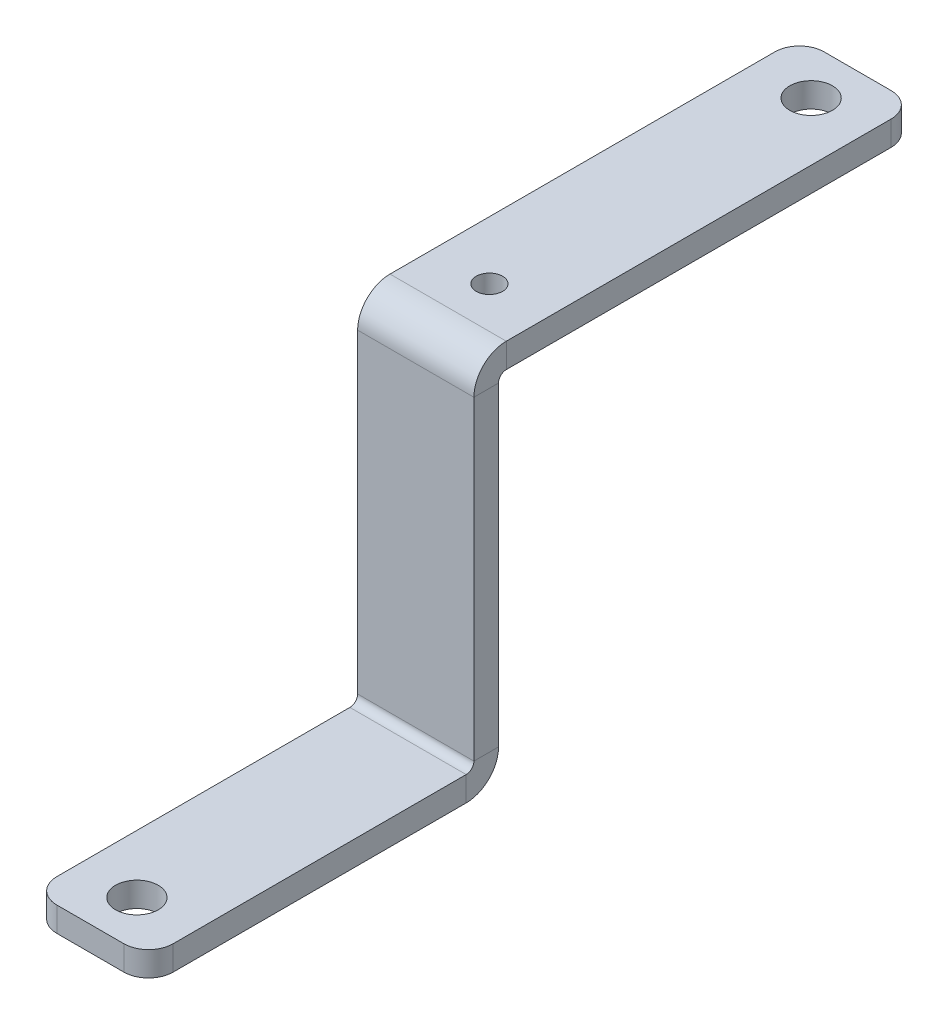
ISO-10303-21;
HEADER;
FILE_DESCRIPTION(('STEP AP214'),'2;1');
FILE_NAME('part.step','',(''),(''),'','','');
FILE_SCHEMA(('AUTOMOTIVE_DESIGN { 1 0 10303 214 1 1 1 1 }'));
ENDSEC;
DATA;
#1=APPLICATION_CONTEXT('core data for automotive mechanical design processes');
#2=APPLICATION_PROTOCOL_DEFINITION('international standard','automotive_design',2000,#1);
#3=PRODUCT_CONTEXT('',#1,'mechanical');
#4=PRODUCT('Part','Part','',(#3));
#5=PRODUCT_RELATED_PRODUCT_CATEGORY('part','',(#4));
#6=PRODUCT_DEFINITION_FORMATION('','',#4);
#7=PRODUCT_DEFINITION_CONTEXT('part definition',#1,'design');
#8=PRODUCT_DEFINITION('design','',#6,#7);
#9=PRODUCT_DEFINITION_SHAPE('','',#8);
#10=(LENGTH_UNIT() NAMED_UNIT(*) SI_UNIT(.MILLI.,.METRE.));
#11=(NAMED_UNIT(*) PLANE_ANGLE_UNIT() SI_UNIT($,.RADIAN.));
#12=(NAMED_UNIT(*) SI_UNIT($,.STERADIAN.) SOLID_ANGLE_UNIT());
#13=UNCERTAINTY_MEASURE_WITH_UNIT(LENGTH_MEASURE(1.E-05),#10,'distance_accuracy_value','');
#14=(GEOMETRIC_REPRESENTATION_CONTEXT(3) GLOBAL_UNCERTAINTY_ASSIGNED_CONTEXT((#13)) GLOBAL_UNIT_ASSIGNED_CONTEXT((#10,
#11,#12)) REPRESENTATION_CONTEXT('',''));
#15=CARTESIAN_POINT('',(0.,0.,0.));
#16=DIRECTION('',(0.,0.,1.));
#17=DIRECTION('',(1.,0.,0.));
#18=AXIS2_PLACEMENT_3D('',#15,#16,#17);
#19=CARTESIAN_POINT('',(0.,45.825,0.));
#20=DIRECTION('',(0.,-1.,0.));
#21=DIRECTION('',(0.,0.,-1.));
#22=AXIS2_PLACEMENT_3D('',#19,#20,#21);
#23=PLANE('',#22);
#24=CARTESIAN_POINT('',(0.,45.825,-70.4000000000001));
#25=DIRECTION('',(0.,1.,0.));
#26=DIRECTION('',(0.,0.,1.));
#27=AXIS2_PLACEMENT_3D('',#24,#25,#26);
#28=CIRCLE('',#27,2.74999999999999);
#29=CARTESIAN_POINT('',(0.,45.825,-67.6500000000001));
#30=VERTEX_POINT('',#29);
#31=EDGE_CURVE('E332',#30,#30,#28,.T.);
#32=ORIENTED_EDGE('',*,*,#31,.F.);
#33=EDGE_LOOP('',(#32));
#34=FACE_BOUND('',#33,.T.);
#35=DIRECTION('',(-1.,0.,0.));
#36=VECTOR('',#35,1.);
#37=CARTESIAN_POINT('',(0.,45.825,-76.4000000000001));
#38=LINE('',#37,#36);
#39=CARTESIAN_POINT('',(4.325,45.825,-76.4000000000001));
#40=VERTEX_POINT('',#39);
#41=CARTESIAN_POINT('',(-4.32499999999999,45.825,-76.4000000000001));
#42=VERTEX_POINT('',#41);
#43=EDGE_CURVE('E237',#40,#42,#38,.T.);
#44=ORIENTED_EDGE('',*,*,#43,.T.);
#45=CARTESIAN_POINT('',(-4.32499999999999,45.825,-73.2250000000002));
#46=DIRECTION('',(0.,-1.,0.));
#47=DIRECTION('',(0.,0.,-1.));
#48=AXIS2_PLACEMENT_3D('',#45,#46,#47);
#49=CIRCLE('',#48,3.175);
#50=CARTESIAN_POINT('',(-7.49999999999999,45.825,-73.2250000000002));
#51=VERTEX_POINT('',#50);
#52=EDGE_CURVE('E346',#42,#51,#49,.F.);
#53=ORIENTED_EDGE('',*,*,#52,.T.);
#54=DIRECTION('',(0.,0.,1.));
#55=VECTOR('',#54,1.);
#56=CARTESIAN_POINT('',(-7.49999999999999,45.825,0.));
#57=LINE('',#56,#55);
#58=CARTESIAN_POINT('',(-7.49999999999999,45.825,-23.5750000000001));
#59=VERTEX_POINT('',#58);
#60=EDGE_CURVE('E231',#51,#59,#57,.T.);
#61=ORIENTED_EDGE('',*,*,#60,.T.);
#62=DIRECTION('',(1.,0.,0.));
#63=VECTOR('',#62,1.);
#64=CARTESIAN_POINT('',(-7.49999999999999,45.825,-23.5750000000001));
#65=LINE('',#64,#63);
#66=CARTESIAN_POINT('',(7.5,45.825,-23.5750000000001));
#67=VERTEX_POINT('',#66);
#68=EDGE_CURVE('E204',#67,#59,#65,.F.);
#69=ORIENTED_EDGE('',*,*,#68,.F.);
#70=DIRECTION('',(0.,0.,-1.));
#71=VECTOR('',#70,1.);
#72=CARTESIAN_POINT('',(7.5,45.825,0.));
#73=LINE('',#72,#71);
#74=CARTESIAN_POINT('',(7.5,45.825,-73.2250000000002));
#75=VERTEX_POINT('',#74);
#76=EDGE_CURVE('E228',#67,#75,#73,.T.);
#77=ORIENTED_EDGE('',*,*,#76,.T.);
#78=CARTESIAN_POINT('',(4.325,45.825,-73.2250000000002));
#79=DIRECTION('',(0.,-1.,0.));
#80=DIRECTION('',(0.,0.,-1.));
#81=AXIS2_PLACEMENT_3D('',#78,#79,#80);
#82=CIRCLE('',#81,3.175);
#83=EDGE_CURVE('E344',#75,#40,#82,.F.);
#84=ORIENTED_EDGE('',*,*,#83,.T.);
#85=EDGE_LOOP('',(#44,#53,#61,#69,#77,#84));
#86=FACE_BOUND('',#85,.T.);
#87=CARTESIAN_POINT('',(0.,45.825,-28.9000000000002));
#88=DIRECTION('',(0.,1.,0.));
#89=DIRECTION('',(0.,0.,1.));
#90=AXIS2_PLACEMENT_3D('',#87,#88,#89);
#91=CIRCLE('',#90,1.69999999999999);
#92=CARTESIAN_POINT('',(0.,45.825,-27.2000000000002));
#93=VERTEX_POINT('',#92);
#94=EDGE_CURVE('E722',#93,#93,#91,.T.);
#95=ORIENTED_EDGE('',*,*,#94,.F.);
#96=EDGE_LOOP('',(#95));
#97=FACE_BOUND('',#96,.T.);
#98=ADVANCED_FACE('F87',(#34,#86,#97),#23,.F.);
#99=CARTESIAN_POINT('',(7.5,0.,-22.575));
#100=DIRECTION('',(-1.,0.,0.));
#101=DIRECTION('',(0.,-1.,0.));
#102=AXIS2_PLACEMENT_3D('',#99,#100,#101);
#103=PLANE('',#102);
#104=DIRECTION('',(0.,0.,1.));
#105=VECTOR('',#104,1.);
#106=CARTESIAN_POINT('',(7.5,41.65,-22.5750000000002));
#107=LINE('',#106,#105);
#108=CARTESIAN_POINT('',(7.5,41.65,-22.5750000000002));
#109=VERTEX_POINT('',#108);
#110=CARTESIAN_POINT('',(7.5,41.65,-19.4000000000002));
#111=VERTEX_POINT('',#110);
#112=EDGE_CURVE('E256',#109,#111,#107,.T.);
#113=ORIENTED_EDGE('',*,*,#112,.T.);
#114=DIRECTION('',(0.,1.,0.));
#115=VECTOR('',#114,1.);
#116=CARTESIAN_POINT('',(7.5,0.,-19.4));
#117=LINE('',#116,#115);
#118=CARTESIAN_POINT('',(7.5,0.999999999999987,-19.4));
#119=VERTEX_POINT('',#118);
#120=EDGE_CURVE('E277',#111,#119,#117,.F.);
#121=ORIENTED_EDGE('',*,*,#120,.T.);
#122=DIRECTION('',(0.,0.,1.));
#123=VECTOR('',#122,1.);
#124=CARTESIAN_POINT('',(7.5,1.00000000000002,-22.575));
#125=LINE('',#124,#123);
#126=CARTESIAN_POINT('',(7.5,0.999999999999976,-22.575));
#127=VERTEX_POINT('',#126);
#128=EDGE_CURVE('E266',#119,#127,#125,.F.);
#129=ORIENTED_EDGE('',*,*,#128,.T.);
#130=DIRECTION('',(0.,-1.,0.));
#131=VECTOR('',#130,1.);
#132=CARTESIAN_POINT('',(7.5,0.,-22.575));
#133=LINE('',#132,#131);
#134=EDGE_CURVE('E272',#109,#127,#133,.T.);
#135=ORIENTED_EDGE('',*,*,#134,.F.);
#136=EDGE_LOOP('',(#113,#121,#129,#135));
#137=FACE_BOUND('',#136,.T.);
#138=ADVANCED_FACE('F411',(#137),#103,.F.);
#139=CARTESIAN_POINT('',(-7.5,45.825,-22.5750000000002));
#140=DIRECTION('',(1.,0.,0.));
#141=DIRECTION('',(0.,1.,0.));
#142=AXIS2_PLACEMENT_3D('',#139,#140,#141);
#143=PLANE('',#142);
#144=DIRECTION('',(0.,0.,1.));
#145=VECTOR('',#144,1.);
#146=CARTESIAN_POINT('',(-7.49999999999999,41.65,-22.5750000000002));
#147=LINE('',#146,#145);
#148=CARTESIAN_POINT('',(-7.49999999999999,41.65,-22.5750000000002));
#149=VERTEX_POINT('',#148);
#150=CARTESIAN_POINT('',(-7.5,41.65,-19.4000000000001));
#151=VERTEX_POINT('',#150);
#152=EDGE_CURVE('E263',#149,#151,#147,.T.);
#153=ORIENTED_EDGE('',*,*,#152,.F.);
#154=DIRECTION('',(0.,1.,0.));
#155=VECTOR('',#154,1.);
#156=CARTESIAN_POINT('',(-7.5,0.,-22.575));
#157=LINE('',#156,#155);
#158=CARTESIAN_POINT('',(-7.5,1.00000000000002,-22.575));
#159=VERTEX_POINT('',#158);
#160=EDGE_CURVE('E268',#159,#149,#157,.T.);
#161=ORIENTED_EDGE('',*,*,#160,.F.);
#162=DIRECTION('',(0.,0.,1.));
#163=VECTOR('',#162,1.);
#164=CARTESIAN_POINT('',(-7.5,0.999999999999997,-19.4));
#165=LINE('',#164,#163);
#166=CARTESIAN_POINT('',(-7.5,0.999999999999987,-19.4));
#167=VERTEX_POINT('',#166);
#168=EDGE_CURVE('E282',#167,#159,#165,.F.);
#169=ORIENTED_EDGE('',*,*,#168,.F.);
#170=DIRECTION('',(0.,-1.,0.));
#171=VECTOR('',#170,1.);
#172=CARTESIAN_POINT('',(-7.5,45.825,-19.4000000000002));
#173=LINE('',#172,#171);
#174=EDGE_CURVE('E274',#167,#151,#173,.F.);
#175=ORIENTED_EDGE('',*,*,#174,.T.);
#176=EDGE_LOOP('',(#153,#161,#169,#175));
#177=FACE_BOUND('',#176,.T.);
#178=ADVANCED_FACE('F401',(#177),#143,.F.);
#179=CARTESIAN_POINT('',(0.,0.,-22.575));
#180=DIRECTION('',(0.,0.,1.));
#181=DIRECTION('',(0.,-1.,0.));
#182=AXIS2_PLACEMENT_3D('',#179,#180,#181);
#183=PLANE('',#182);
#184=DIRECTION('',(1.,0.,0.));
#185=VECTOR('',#184,1.);
#186=CARTESIAN_POINT('',(7.5,41.65,-22.5750000000002));
#187=LINE('',#186,#185);
#188=EDGE_CURVE('E260',#109,#149,#187,.F.);
#189=ORIENTED_EDGE('',*,*,#188,.F.);
#190=ORIENTED_EDGE('',*,*,#134,.T.);
#191=DIRECTION('',(-1.,0.,0.));
#192=VECTOR('',#191,1.);
#193=CARTESIAN_POINT('',(7.5,1.00000000000002,-22.575));
#194=LINE('',#193,#192);
#195=EDGE_CURVE('E279',#159,#127,#194,.F.);
#196=ORIENTED_EDGE('',*,*,#195,.F.);
#197=ORIENTED_EDGE('',*,*,#160,.T.);
#198=EDGE_LOOP('',(#189,#190,#196,#197));
#199=FACE_BOUND('',#198,.T.);
#200=ADVANCED_FACE('F398',(#199),#183,.F.);
#201=CARTESIAN_POINT('',(0.,0.,-19.4));
#202=DIRECTION('',(0.,0.,1.));
#203=DIRECTION('',(0.,-1.,0.));
#204=AXIS2_PLACEMENT_3D('',#201,#202,#203);
#205=PLANE('',#204);
#206=ORIENTED_EDGE('',*,*,#120,.F.);
#207=DIRECTION('',(1.,0.,0.));
#208=VECTOR('',#207,1.);
#209=CARTESIAN_POINT('',(7.5,41.65,-19.4000000000002));
#210=LINE('',#209,#208);
#211=EDGE_CURVE('E207',#111,#151,#210,.F.);
#212=ORIENTED_EDGE('',*,*,#211,.T.);
#213=ORIENTED_EDGE('',*,*,#174,.F.);
#214=DIRECTION('',(-1.,0.,0.));
#215=VECTOR('',#214,1.);
#216=CARTESIAN_POINT('',(7.5,0.999999999999997,-19.4));
#217=LINE('',#216,#215);
#218=EDGE_CURVE('E285',#119,#167,#217,.T.);
#219=ORIENTED_EDGE('',*,*,#218,.F.);
#220=EDGE_LOOP('',(#206,#212,#213,#219));
#221=FACE_BOUND('',#220,.T.);
#222=ADVANCED_FACE('F408',(#221),#205,.T.);
#223=CARTESIAN_POINT('',(-7.5,-3.175,22.575));
#224=DIRECTION('',(-1.,0.,0.));
#225=DIRECTION('',(0.,0.,1.));
#226=AXIS2_PLACEMENT_3D('',#223,#224,#225);
#227=PLANE('',#226);
#228=DIRECTION('',(0.,0.,1.));
#229=VECTOR('',#228,1.);
#230=CARTESIAN_POINT('',(-7.5,-3.175,22.575));
#231=LINE('',#230,#229);
#232=CARTESIAN_POINT('',(-7.5,-3.17500000000001,-18.4));
#233=VERTEX_POINT('',#232);
#234=CARTESIAN_POINT('',(-7.5,-3.175,19.4));
#235=VERTEX_POINT('',#234);
#236=EDGE_CURVE('E315',#233,#235,#231,.T.);
#237=ORIENTED_EDGE('',*,*,#236,.T.);
#238=DIRECTION('',(0.,1.,0.));
#239=VECTOR('',#238,1.);
#240=CARTESIAN_POINT('',(-7.5,-3.175,19.4));
#241=LINE('',#240,#239);
#242=CARTESIAN_POINT('',(-7.5,0.,19.4));
#243=VERTEX_POINT('',#242);
#244=EDGE_CURVE('E349',#235,#243,#241,.T.);
#245=ORIENTED_EDGE('',*,*,#244,.T.);
#246=DIRECTION('',(0.,0.,1.));
#247=VECTOR('',#246,1.);
#248=CARTESIAN_POINT('',(-7.5,0.,22.575));
#249=LINE('',#248,#247);
#250=CARTESIAN_POINT('',(-7.5,0.,-18.4));
#251=VERTEX_POINT('',#250);
#252=EDGE_CURVE('E323',#251,#243,#249,.T.);
#253=ORIENTED_EDGE('',*,*,#252,.F.);
#254=DIRECTION('',(0.,-1.,0.));
#255=VECTOR('',#254,1.);
#256=CARTESIAN_POINT('',(-7.5,0.,-18.4));
#257=LINE('',#256,#255);
#258=EDGE_CURVE('E296',#251,#233,#257,.T.);
#259=ORIENTED_EDGE('',*,*,#258,.T.);
#260=EDGE_LOOP('',(#237,#245,#253,#259));
#261=FACE_BOUND('',#260,.T.);
#262=ADVANCED_FACE('F368',(#261),#227,.T.);
#263=CARTESIAN_POINT('',(0.,-3.175,0.));
#264=DIRECTION('',(0.,-1.,0.));
#265=DIRECTION('',(0.,0.,-1.));
#266=AXIS2_PLACEMENT_3D('',#263,#264,#265);
#267=PLANE('',#266);
#268=CARTESIAN_POINT('',(0.,-3.17500000000001,16.575));
#269=DIRECTION('',(0.,1.,0.));
#270=DIRECTION('',(0.,0.,1.));
#271=AXIS2_PLACEMENT_3D('',#268,#269,#270);
#272=CIRCLE('',#271,2.75);
#273=CARTESIAN_POINT('',(0.,-3.17500000000001,19.325));
#274=VERTEX_POINT('',#273);
#275=EDGE_CURVE('E253',#274,#274,#272,.T.);
#276=ORIENTED_EDGE('',*,*,#275,.T.);
#277=EDGE_LOOP('',(#276));
#278=FACE_BOUND('',#277,.T.);
#279=DIRECTION('',(1.,0.,0.));
#280=VECTOR('',#279,1.);
#281=CARTESIAN_POINT('',(-7.5,-3.175,22.575));
#282=LINE('',#281,#280);
#283=CARTESIAN_POINT('',(-4.325,-3.175,22.575));
#284=VERTEX_POINT('',#283);
#285=CARTESIAN_POINT('',(4.325,-3.175,22.575));
#286=VERTEX_POINT('',#285);
#287=EDGE_CURVE('E319',#284,#286,#282,.T.);
#288=ORIENTED_EDGE('',*,*,#287,.F.);
#289=CARTESIAN_POINT('',(-4.325,-3.175,19.4));
#290=DIRECTION('',(0.,-1.,0.));
#291=DIRECTION('',(0.,0.,-1.));
#292=AXIS2_PLACEMENT_3D('',#289,#290,#291);
#293=CIRCLE('',#292,3.175);
#294=EDGE_CURVE('E95',#284,#235,#293,.T.);
#295=ORIENTED_EDGE('',*,*,#294,.T.);
#296=ORIENTED_EDGE('',*,*,#236,.F.);
#297=DIRECTION('',(-1.,0.,0.));
#298=VECTOR('',#297,1.);
#299=CARTESIAN_POINT('',(-7.5,-3.17500000000001,-18.4));
#300=LINE('',#299,#298);
#301=CARTESIAN_POINT('',(7.5,-3.175,-18.4));
#302=VERTEX_POINT('',#301);
#303=EDGE_CURVE('E289',#233,#302,#300,.F.);
#304=ORIENTED_EDGE('',*,*,#303,.T.);
#305=DIRECTION('',(0.,0.,-1.));
#306=VECTOR('',#305,1.);
#307=CARTESIAN_POINT('',(7.5,-3.175,22.575));
#308=LINE('',#307,#306);
#309=CARTESIAN_POINT('',(7.5,-3.175,19.4));
#310=VERTEX_POINT('',#309);
#311=EDGE_CURVE('E313',#310,#302,#308,.T.);
#312=ORIENTED_EDGE('',*,*,#311,.F.);
#313=CARTESIAN_POINT('',(4.325,-3.175,19.4));
#314=DIRECTION('',(0.,-1.,0.));
#315=DIRECTION('',(0.,0.,-1.));
#316=AXIS2_PLACEMENT_3D('',#313,#314,#315);
#317=CIRCLE('',#316,3.175);
#318=EDGE_CURVE('E107',#310,#286,#317,.T.);
#319=ORIENTED_EDGE('',*,*,#318,.T.);
#320=EDGE_LOOP('',(#288,#295,#296,#304,#312,#319));
#321=FACE_BOUND('',#320,.T.);
#322=ADVANCED_FACE('F363',(#278,#321),#267,.T.);
#323=CARTESIAN_POINT('',(0.,0.,0.));
#324=DIRECTION('',(0.,-1.,0.));
#325=DIRECTION('',(0.,0.,-1.));
#326=AXIS2_PLACEMENT_3D('',#323,#324,#325);
#327=PLANE('',#326);
#328=CARTESIAN_POINT('',(0.,0.,16.575));
#329=DIRECTION('',(0.,1.,0.));
#330=DIRECTION('',(0.,0.,1.));
#331=AXIS2_PLACEMENT_3D('',#328,#329,#330);
#332=CIRCLE('',#331,2.75);
#333=CARTESIAN_POINT('',(0.,0.,19.325));
#334=VERTEX_POINT('',#333);
#335=EDGE_CURVE('E331',#334,#334,#332,.T.);
#336=ORIENTED_EDGE('',*,*,#335,.F.);
#337=EDGE_LOOP('',(#336));
#338=FACE_BOUND('',#337,.T.);
#339=ORIENTED_EDGE('',*,*,#252,.T.);
#340=CARTESIAN_POINT('',(-4.325,0.,19.4));
#341=DIRECTION('',(0.,-1.,0.));
#342=DIRECTION('',(0.,0.,-1.));
#343=AXIS2_PLACEMENT_3D('',#340,#341,#342);
#344=CIRCLE('',#343,3.175);
#345=CARTESIAN_POINT('',(-4.325,0.,22.575));
#346=VERTEX_POINT('',#345);
#347=EDGE_CURVE('E354',#243,#346,#344,.F.);
#348=ORIENTED_EDGE('',*,*,#347,.T.);
#349=DIRECTION('',(1.,0.,0.));
#350=VECTOR('',#349,1.);
#351=CARTESIAN_POINT('',(-7.5,0.,22.575));
#352=LINE('',#351,#350);
#353=CARTESIAN_POINT('',(4.325,0.,22.575));
#354=VERTEX_POINT('',#353);
#355=EDGE_CURVE('E316',#346,#354,#352,.T.);
#356=ORIENTED_EDGE('',*,*,#355,.T.);
#357=CARTESIAN_POINT('',(4.325,0.,19.4));
#358=DIRECTION('',(0.,-1.,0.));
#359=DIRECTION('',(0.,0.,-1.));
#360=AXIS2_PLACEMENT_3D('',#357,#358,#359);
#361=CIRCLE('',#360,3.175);
#362=CARTESIAN_POINT('',(7.5,0.,19.4));
#363=VERTEX_POINT('',#362);
#364=EDGE_CURVE('E352',#354,#363,#361,.F.);
#365=ORIENTED_EDGE('',*,*,#364,.T.);
#366=DIRECTION('',(0.,0.,-1.));
#367=VECTOR('',#366,1.);
#368=CARTESIAN_POINT('',(7.5,0.,22.575));
#369=LINE('',#368,#367);
#370=CARTESIAN_POINT('',(7.5,0.,-18.4));
#371=VERTEX_POINT('',#370);
#372=EDGE_CURVE('E310',#363,#371,#369,.T.);
#373=ORIENTED_EDGE('',*,*,#372,.T.);
#374=DIRECTION('',(-1.,0.,0.));
#375=VECTOR('',#374,1.);
#376=CARTESIAN_POINT('',(-7.5,0.,-18.4));
#377=LINE('',#376,#375);
#378=EDGE_CURVE('E302',#251,#371,#377,.F.);
#379=ORIENTED_EDGE('',*,*,#378,.F.);
#380=EDGE_LOOP('',(#339,#348,#356,#365,#373,#379));
#381=FACE_BOUND('',#380,.T.);
#382=ADVANCED_FACE('F373',(#338,#381),#327,.F.);
#383=CARTESIAN_POINT('',(7.5,-3.175,22.575));
#384=DIRECTION('',(1.,0.,0.));
#385=DIRECTION('',(0.,0.,-1.));
#386=AXIS2_PLACEMENT_3D('',#383,#384,#385);
#387=PLANE('',#386);
#388=ORIENTED_EDGE('',*,*,#372,.F.);
#389=DIRECTION('',(0.,1.,0.));
#390=VECTOR('',#389,1.);
#391=CARTESIAN_POINT('',(7.5,-3.175,19.4));
#392=LINE('',#391,#390);
#393=EDGE_CURVE('E13',#363,#310,#392,.F.);
#394=ORIENTED_EDGE('',*,*,#393,.T.);
#395=ORIENTED_EDGE('',*,*,#311,.T.);
#396=DIRECTION('',(0.,-1.,0.));
#397=VECTOR('',#396,1.);
#398=CARTESIAN_POINT('',(7.5,0.,-18.4));
#399=LINE('',#398,#397);
#400=EDGE_CURVE('E307',#371,#302,#399,.T.);
#401=ORIENTED_EDGE('',*,*,#400,.F.);
#402=EDGE_LOOP('',(#388,#394,#395,#401));
#403=FACE_BOUND('',#402,.T.);
#404=ADVANCED_FACE('F380',(#403),#387,.T.);
#405=CARTESIAN_POINT('',(-7.5,-3.175,22.575));
#406=DIRECTION('',(0.,0.,1.));
#407=DIRECTION('',(1.,0.,0.));
#408=AXIS2_PLACEMENT_3D('',#405,#406,#407);
#409=PLANE('',#408);
#410=ORIENTED_EDGE('',*,*,#355,.F.);
#411=DIRECTION('',(0.,1.,0.));
#412=VECTOR('',#411,1.);
#413=CARTESIAN_POINT('',(-4.325,-3.175,22.575));
#414=LINE('',#413,#412);
#415=EDGE_CURVE('E359',#346,#284,#414,.F.);
#416=ORIENTED_EDGE('',*,*,#415,.T.);
#417=ORIENTED_EDGE('',*,*,#287,.T.);
#418=DIRECTION('',(0.,1.,0.));
#419=VECTOR('',#418,1.);
#420=CARTESIAN_POINT('',(4.325,-3.175,22.575));
#421=LINE('',#420,#419);
#422=EDGE_CURVE('E356',#286,#354,#421,.T.);
#423=ORIENTED_EDGE('',*,*,#422,.T.);
#424=EDGE_LOOP('',(#410,#416,#417,#423));
#425=FACE_BOUND('',#424,.T.);
#426=ADVANCED_FACE('F376',(#425),#409,.T.);
#427=CARTESIAN_POINT('',(7.5,0.99999999999999,-18.4));
#428=DIRECTION('',(1.,0.,0.));
#429=DIRECTION('',(0.,0.,-1.));
#430=AXIS2_PLACEMENT_3D('',#427,#428,#429);
#431=PLANE('',#430);
#432=ORIENTED_EDGE('',*,*,#128,.F.);
#433=CARTESIAN_POINT('',(7.5,0.99999999999999,-18.4));
#434=DIRECTION('',(-1.,0.,0.));
#435=DIRECTION('',(0.,0.,1.));
#436=AXIS2_PLACEMENT_3D('',#433,#434,#435);
#437=CIRCLE('',#436,1.);
#438=EDGE_CURVE('E299',#371,#119,#437,.F.);
#439=ORIENTED_EDGE('',*,*,#438,.F.);
#440=ORIENTED_EDGE('',*,*,#400,.T.);
#441=CARTESIAN_POINT('',(7.5,0.99999999999999,-18.4));
#442=DIRECTION('',(-1.,0.,0.));
#443=DIRECTION('',(0.,0.,1.));
#444=AXIS2_PLACEMENT_3D('',#441,#442,#443);
#445=CIRCLE('',#444,4.175);
#446=EDGE_CURVE('E292',#302,#127,#445,.F.);
#447=ORIENTED_EDGE('',*,*,#446,.T.);
#448=EDGE_LOOP('',(#432,#439,#440,#447));
#449=FACE_BOUND('',#448,.T.);
#450=ADVANCED_FACE('F385',(#449),#431,.T.);
#451=CARTESIAN_POINT('',(-7.5,0.99999999999999,-18.4));
#452=DIRECTION('',(1.,0.,0.));
#453=DIRECTION('',(0.,0.,-1.));
#454=AXIS2_PLACEMENT_3D('',#451,#452,#453);
#455=PLANE('',#454);
#456=CARTESIAN_POINT('',(-7.5,0.99999999999999,-18.4));
#457=DIRECTION('',(-1.,0.,0.));
#458=DIRECTION('',(0.,0.,1.));
#459=AXIS2_PLACEMENT_3D('',#456,#457,#458);
#460=CIRCLE('',#459,1.);
#461=EDGE_CURVE('E271',#167,#251,#460,.T.);
#462=ORIENTED_EDGE('',*,*,#461,.F.);
#463=ORIENTED_EDGE('',*,*,#168,.T.);
#464=CARTESIAN_POINT('',(-7.5,0.99999999999999,-18.4));
#465=DIRECTION('',(-1.,0.,0.));
#466=DIRECTION('',(0.,0.,1.));
#467=AXIS2_PLACEMENT_3D('',#464,#465,#466);
#468=CIRCLE('',#467,4.175);
#469=EDGE_CURVE('E293',#159,#233,#468,.T.);
#470=ORIENTED_EDGE('',*,*,#469,.T.);
#471=ORIENTED_EDGE('',*,*,#258,.F.);
#472=EDGE_LOOP('',(#462,#463,#470,#471));
#473=FACE_BOUND('',#472,.T.);
#474=ADVANCED_FACE('F390',(#473),#455,.F.);
#475=CARTESIAN_POINT('',(-7.5,0.99999999999999,-18.4));
#476=DIRECTION('',(-1.,0.,0.));
#477=DIRECTION('',(0.,0.,-1.));
#478=AXIS2_PLACEMENT_3D('',#475,#476,#477);
#479=CYLINDRICAL_SURFACE('',#478,4.175);
#480=ORIENTED_EDGE('',*,*,#303,.F.);
#481=ORIENTED_EDGE('',*,*,#469,.F.);
#482=ORIENTED_EDGE('',*,*,#195,.T.);
#483=ORIENTED_EDGE('',*,*,#446,.F.);
#484=EDGE_LOOP('',(#480,#481,#482,#483));
#485=FACE_BOUND('',#484,.T.);
#486=ADVANCED_FACE('F387',(#485),#479,.T.);
#487=CARTESIAN_POINT('',(-7.5,0.99999999999999,-18.4));
#488=DIRECTION('',(-1.,0.,0.));
#489=DIRECTION('',(0.,0.,-1.));
#490=AXIS2_PLACEMENT_3D('',#487,#488,#489);
#491=CYLINDRICAL_SURFACE('',#490,1.);
#492=ORIENTED_EDGE('',*,*,#378,.T.);
#493=ORIENTED_EDGE('',*,*,#438,.T.);
#494=ORIENTED_EDGE('',*,*,#218,.T.);
#495=ORIENTED_EDGE('',*,*,#461,.T.);
#496=EDGE_LOOP('',(#492,#493,#494,#495));
#497=FACE_BOUND('',#496,.T.);
#498=ADVANCED_FACE('F413',(#497),#491,.F.);
#499=CARTESIAN_POINT('',(-7.49999999999999,41.65,-23.5750000000001));
#500=DIRECTION('',(-1.,0.,0.));
#501=DIRECTION('',(0.,0.,1.));
#502=AXIS2_PLACEMENT_3D('',#499,#500,#501);
#503=PLANE('',#502);
#504=DIRECTION('',(0.,-1.,0.));
#505=VECTOR('',#504,1.);
#506=CARTESIAN_POINT('',(-7.49999999999999,45.825,-23.5750000000001));
#507=LINE('',#506,#505);
#508=CARTESIAN_POINT('',(-7.49999999999999,42.65,-23.5750000000001));
#509=VERTEX_POINT('',#508);
#510=EDGE_CURVE('E250',#509,#59,#507,.F.);
#511=ORIENTED_EDGE('',*,*,#510,.F.);
#512=CARTESIAN_POINT('',(-7.49999999999999,41.65,-23.5750000000001));
#513=DIRECTION('',(1.,0.,0.));
#514=DIRECTION('',(0.,0.,-1.));
#515=AXIS2_PLACEMENT_3D('',#512,#513,#514);
#516=CIRCLE('',#515,0.999999999999994);
#517=EDGE_CURVE('E210',#149,#509,#516,.F.);
#518=ORIENTED_EDGE('',*,*,#517,.F.);
#519=ORIENTED_EDGE('',*,*,#152,.T.);
#520=CARTESIAN_POINT('',(-7.49999999999999,41.65,-23.5750000000001));
#521=DIRECTION('',(1.,0.,0.));
#522=DIRECTION('',(0.,0.,-1.));
#523=AXIS2_PLACEMENT_3D('',#520,#521,#522);
#524=CIRCLE('',#523,4.17499999999999);
#525=EDGE_CURVE('E255',#151,#59,#524,.F.);
#526=ORIENTED_EDGE('',*,*,#525,.T.);
#527=EDGE_LOOP('',(#511,#518,#519,#526));
#528=FACE_BOUND('',#527,.T.);
#529=ADVANCED_FACE('F405',(#528),#503,.T.);
#530=CARTESIAN_POINT('',(7.5,41.65,-23.5750000000001));
#531=DIRECTION('',(-1.,0.,0.));
#532=DIRECTION('',(0.,0.,1.));
#533=AXIS2_PLACEMENT_3D('',#530,#531,#532);
#534=PLANE('',#533);
#535=CARTESIAN_POINT('',(7.5,41.65,-23.5750000000001));
#536=DIRECTION('',(1.,0.,0.));
#537=DIRECTION('',(0.,0.,-1.));
#538=AXIS2_PLACEMENT_3D('',#535,#536,#537);
#539=CIRCLE('',#538,0.999999999999994);
#540=CARTESIAN_POINT('',(7.5,42.65,-23.5750000000001));
#541=VERTEX_POINT('',#540);
#542=EDGE_CURVE('E217',#541,#109,#539,.T.);
#543=ORIENTED_EDGE('',*,*,#542,.F.);
#544=DIRECTION('',(0.,-1.,0.));
#545=VECTOR('',#544,1.);
#546=CARTESIAN_POINT('',(7.5,42.65,-23.5750000000001));
#547=LINE('',#546,#545);
#548=EDGE_CURVE('E214',#541,#67,#547,.F.);
#549=ORIENTED_EDGE('',*,*,#548,.T.);
#550=CARTESIAN_POINT('',(7.5,41.65,-23.5750000000001));
#551=DIRECTION('',(1.,0.,0.));
#552=DIRECTION('',(0.,0.,-1.));
#553=AXIS2_PLACEMENT_3D('',#550,#551,#552);
#554=CIRCLE('',#553,4.17499999999999);
#555=EDGE_CURVE('E200',#67,#111,#554,.T.);
#556=ORIENTED_EDGE('',*,*,#555,.T.);
#557=ORIENTED_EDGE('',*,*,#112,.F.);
#558=EDGE_LOOP('',(#543,#549,#556,#557));
#559=FACE_BOUND('',#558,.T.);
#560=ADVANCED_FACE('F215',(#559),#534,.F.);
#561=CARTESIAN_POINT('',(7.5,41.65,-23.5750000000001));
#562=DIRECTION('',(1.,0.,0.));
#563=DIRECTION('',(0.,1.,0.));
#564=AXIS2_PLACEMENT_3D('',#561,#562,#563);
#565=CYLINDRICAL_SURFACE('',#564,4.17499999999999);
#566=ORIENTED_EDGE('',*,*,#211,.F.);
#567=ORIENTED_EDGE('',*,*,#555,.F.);
#568=ORIENTED_EDGE('',*,*,#68,.T.);
#569=ORIENTED_EDGE('',*,*,#525,.F.);
#570=EDGE_LOOP('',(#566,#567,#568,#569));
#571=FACE_BOUND('',#570,.T.);
#572=ADVANCED_FACE('F202',(#571),#565,.T.);
#573=CARTESIAN_POINT('',(7.5,41.65,-23.5750000000001));
#574=DIRECTION('',(1.,0.,0.));
#575=DIRECTION('',(0.,1.,0.));
#576=AXIS2_PLACEMENT_3D('',#573,#574,#575);
#577=CYLINDRICAL_SURFACE('',#576,0.999999999999994);
#578=ORIENTED_EDGE('',*,*,#188,.T.);
#579=ORIENTED_EDGE('',*,*,#517,.T.);
#580=DIRECTION('',(1.,0.,0.));
#581=VECTOR('',#580,1.);
#582=CARTESIAN_POINT('',(-7.49999999999999,42.65,-23.5750000000001));
#583=LINE('',#582,#581);
#584=EDGE_CURVE('E222',#509,#541,#583,.T.);
#585=ORIENTED_EDGE('',*,*,#584,.T.);
#586=ORIENTED_EDGE('',*,*,#542,.T.);
#587=EDGE_LOOP('',(#578,#579,#585,#586));
#588=FACE_BOUND('',#587,.T.);
#589=ADVANCED_FACE('F450',(#588),#577,.F.);
#590=CARTESIAN_POINT('',(-7.49999999999999,45.825,-22.5750000000001));
#591=DIRECTION('',(1.,0.,0.));
#592=DIRECTION('',(0.,0.,-1.));
#593=AXIS2_PLACEMENT_3D('',#590,#591,#592);
#594=PLANE('',#593);
#595=ORIENTED_EDGE('',*,*,#60,.F.);
#596=DIRECTION('',(0.,-1.,0.));
#597=VECTOR('',#596,1.);
#598=CARTESIAN_POINT('',(-7.49999999999999,45.825,-73.2250000000002));
#599=LINE('',#598,#597);
#600=CARTESIAN_POINT('',(-7.49999999999999,42.65,-73.2250000000002));
#601=VERTEX_POINT('',#600);
#602=EDGE_CURVE('E321',#51,#601,#599,.T.);
#603=ORIENTED_EDGE('',*,*,#602,.T.);
#604=DIRECTION('',(0.,0.,-1.));
#605=VECTOR('',#604,1.);
#606=CARTESIAN_POINT('',(-7.49999999999999,42.65,-22.5750000000001));
#607=LINE('',#606,#605);
#608=EDGE_CURVE('E232',#601,#509,#607,.F.);
#609=ORIENTED_EDGE('',*,*,#608,.T.);
#610=ORIENTED_EDGE('',*,*,#510,.T.);
#611=EDGE_LOOP('',(#595,#603,#609,#610));
#612=FACE_BOUND('',#611,.T.);
#613=ADVANCED_FACE('F447',(#612),#594,.F.);
#614=CARTESIAN_POINT('',(7.5,45.825,-76.4000000000001));
#615=DIRECTION('',(-1.,0.,0.));
#616=DIRECTION('',(0.,0.,1.));
#617=AXIS2_PLACEMENT_3D('',#614,#615,#616);
#618=PLANE('',#617);
#619=DIRECTION('',(0.,0.,1.));
#620=VECTOR('',#619,1.);
#621=CARTESIAN_POINT('',(7.5,42.65,-76.4000000000001));
#622=LINE('',#621,#620);
#623=CARTESIAN_POINT('',(7.5,42.65,-73.2250000000002));
#624=VERTEX_POINT('',#623);
#625=EDGE_CURVE('E246',#541,#624,#622,.F.);
#626=ORIENTED_EDGE('',*,*,#625,.T.);
#627=DIRECTION('',(0.,-1.,0.));
#628=VECTOR('',#627,1.);
#629=CARTESIAN_POINT('',(7.5,45.825,-73.2250000000002));
#630=LINE('',#629,#628);
#631=EDGE_CURVE('E236',#624,#75,#630,.F.);
#632=ORIENTED_EDGE('',*,*,#631,.T.);
#633=ORIENTED_EDGE('',*,*,#76,.F.);
#634=ORIENTED_EDGE('',*,*,#548,.F.);
#635=EDGE_LOOP('',(#626,#632,#633,#634));
#636=FACE_BOUND('',#635,.T.);
#637=ADVANCED_FACE('F234',(#636),#618,.F.);
#638=CARTESIAN_POINT('',(0.,42.65,0.));
#639=DIRECTION('',(0.,-1.,0.));
#640=DIRECTION('',(0.,0.,-1.));
#641=AXIS2_PLACEMENT_3D('',#638,#639,#640);
#642=PLANE('',#641);
#643=CARTESIAN_POINT('',(0.,42.65,-28.9000000000002));
#644=DIRECTION('',(0.,-1.,0.));
#645=DIRECTION('',(0.,0.,-1.));
#646=AXIS2_PLACEMENT_3D('',#643,#644,#645);
#647=CIRCLE('',#646,1.69999999999999);
#648=CARTESIAN_POINT('',(0.,42.65,-30.6000000000001));
#649=VERTEX_POINT('',#648);
#650=EDGE_CURVE('E719',#649,#649,#647,.T.);
#651=ORIENTED_EDGE('',*,*,#650,.F.);
#652=EDGE_LOOP('',(#651));
#653=FACE_BOUND('',#652,.T.);
#654=CARTESIAN_POINT('',(0.,42.65,-70.4000000000001));
#655=DIRECTION('',(0.,-1.,0.));
#656=DIRECTION('',(0.,0.,-1.));
#657=AXIS2_PLACEMENT_3D('',#654,#655,#656);
#658=CIRCLE('',#657,2.74999999999999);
#659=CARTESIAN_POINT('',(0.,42.65,-73.1500000000001));
#660=VERTEX_POINT('',#659);
#661=EDGE_CURVE('E328',#660,#660,#658,.T.);
#662=ORIENTED_EDGE('',*,*,#661,.F.);
#663=EDGE_LOOP('',(#662));
#664=FACE_BOUND('',#663,.T.);
#665=ORIENTED_EDGE('',*,*,#608,.F.);
#666=CARTESIAN_POINT('',(-4.32499999999999,42.65,-73.2250000000002));
#667=DIRECTION('',(0.,-1.,0.));
#668=DIRECTION('',(0.,0.,-1.));
#669=AXIS2_PLACEMENT_3D('',#666,#667,#668);
#670=CIRCLE('',#669,3.175);
#671=CARTESIAN_POINT('',(-4.32499999999999,42.65,-76.4000000000001));
#672=VERTEX_POINT('',#671);
#673=EDGE_CURVE('E337',#601,#672,#670,.T.);
#674=ORIENTED_EDGE('',*,*,#673,.T.);
#675=DIRECTION('',(1.,0.,0.));
#676=VECTOR('',#675,1.);
#677=CARTESIAN_POINT('',(-7.49999999999999,42.65,-76.4000000000001));
#678=LINE('',#677,#676);
#679=CARTESIAN_POINT('',(4.325,42.65,-76.4000000000001));
#680=VERTEX_POINT('',#679);
#681=EDGE_CURVE('E240',#680,#672,#678,.F.);
#682=ORIENTED_EDGE('',*,*,#681,.F.);
#683=CARTESIAN_POINT('',(4.325,42.65,-73.2250000000002));
#684=DIRECTION('',(0.,-1.,0.));
#685=DIRECTION('',(0.,0.,-1.));
#686=AXIS2_PLACEMENT_3D('',#683,#684,#685);
#687=CIRCLE('',#686,3.175);
#688=EDGE_CURVE('E335',#680,#624,#687,.T.);
#689=ORIENTED_EDGE('',*,*,#688,.T.);
#690=ORIENTED_EDGE('',*,*,#625,.F.);
#691=ORIENTED_EDGE('',*,*,#584,.F.);
#692=EDGE_LOOP('',(#665,#674,#682,#689,#690,#691));
#693=FACE_BOUND('',#692,.T.);
#694=ADVANCED_FACE('F437',(#653,#664,#693),#642,.T.);
#695=CARTESIAN_POINT('',(-7.49999999999999,45.825,-76.4000000000001));
#696=DIRECTION('',(0.,0.,1.));
#697=DIRECTION('',(0.,-1.,0.));
#698=AXIS2_PLACEMENT_3D('',#695,#696,#697);
#699=PLANE('',#698);
#700=ORIENTED_EDGE('',*,*,#681,.T.);
#701=DIRECTION('',(0.,-1.,0.));
#702=VECTOR('',#701,1.);
#703=CARTESIAN_POINT('',(-4.32499999999999,45.825,-76.4000000000001));
#704=LINE('',#703,#702);
#705=EDGE_CURVE('E342',#672,#42,#704,.F.);
#706=ORIENTED_EDGE('',*,*,#705,.T.);
#707=ORIENTED_EDGE('',*,*,#43,.F.);
#708=DIRECTION('',(0.,-1.,0.));
#709=VECTOR('',#708,1.);
#710=CARTESIAN_POINT('',(4.325,45.825,-76.4000000000001));
#711=LINE('',#710,#709);
#712=EDGE_CURVE('E339',#40,#680,#711,.T.);
#713=ORIENTED_EDGE('',*,*,#712,.T.);
#714=EDGE_LOOP('',(#700,#706,#707,#713));
#715=FACE_BOUND('',#714,.T.);
#716=ADVANCED_FACE('F440',(#715),#699,.F.);
#717=CARTESIAN_POINT('',(0.,0.,16.575));
#718=DIRECTION('',(0.,1.,0.));
#719=DIRECTION('',(0.,0.,1.));
#720=AXIS2_PLACEMENT_3D('',#717,#718,#719);
#721=CYLINDRICAL_SURFACE('',#720,2.75);
#722=ORIENTED_EDGE('',*,*,#275,.F.);
#723=EDGE_LOOP('',(#722));
#724=FACE_BOUND('',#723,.T.);
#725=ORIENTED_EDGE('',*,*,#335,.T.);
#726=EDGE_LOOP('',(#725));
#727=FACE_BOUND('',#726,.T.);
#728=ADVANCED_FACE('F435',(#724,#727),#721,.F.);
#729=CARTESIAN_POINT('',(0.,45.825,-70.4000000000001));
#730=DIRECTION('',(0.,1.,0.));
#731=DIRECTION('',(0.,0.,1.));
#732=AXIS2_PLACEMENT_3D('',#729,#730,#731);
#733=CYLINDRICAL_SURFACE('',#732,2.74999999999999);
#734=ORIENTED_EDGE('',*,*,#661,.T.);
#735=EDGE_LOOP('',(#734));
#736=FACE_BOUND('',#735,.T.);
#737=ORIENTED_EDGE('',*,*,#31,.T.);
#738=EDGE_LOOP('',(#737));
#739=FACE_BOUND('',#738,.T.);
#740=ADVANCED_FACE('F506',(#736,#739),#733,.F.);
#741=CARTESIAN_POINT('',(0.,45.825,-28.9000000000002));
#742=DIRECTION('',(0.,1.,0.));
#743=DIRECTION('',(0.,0.,1.));
#744=AXIS2_PLACEMENT_3D('',#741,#742,#743);
#745=CYLINDRICAL_SURFACE('',#744,1.69999999999999);
#746=ORIENTED_EDGE('',*,*,#650,.T.);
#747=EDGE_LOOP('',(#746));
#748=FACE_BOUND('',#747,.T.);
#749=ORIENTED_EDGE('',*,*,#94,.T.);
#750=EDGE_LOOP('',(#749));
#751=FACE_BOUND('',#750,.T.);
#752=ADVANCED_FACE('F515',(#748,#751),#745,.F.);
#753=CARTESIAN_POINT('',(-4.32499999999999,45.825,-73.2250000000002));
#754=DIRECTION('',(0.,-1.,0.));
#755=DIRECTION('',(0.,0.,-1.));
#756=AXIS2_PLACEMENT_3D('',#753,#754,#755);
#757=CYLINDRICAL_SURFACE('',#756,3.175);
#758=ORIENTED_EDGE('',*,*,#52,.F.);
#759=ORIENTED_EDGE('',*,*,#705,.F.);
#760=ORIENTED_EDGE('',*,*,#673,.F.);
#761=ORIENTED_EDGE('',*,*,#602,.F.);
#762=EDGE_LOOP('',(#758,#759,#760,#761));
#763=FACE_BOUND('',#762,.T.);
#764=ADVANCED_FACE('F523',(#763),#757,.T.);
#765=CARTESIAN_POINT('',(4.325,45.825,-73.2250000000002));
#766=DIRECTION('',(0.,-1.,0.));
#767=DIRECTION('',(0.,0.,-1.));
#768=AXIS2_PLACEMENT_3D('',#765,#766,#767);
#769=CYLINDRICAL_SURFACE('',#768,3.175);
#770=ORIENTED_EDGE('',*,*,#83,.F.);
#771=ORIENTED_EDGE('',*,*,#631,.F.);
#772=ORIENTED_EDGE('',*,*,#688,.F.);
#773=ORIENTED_EDGE('',*,*,#712,.F.);
#774=EDGE_LOOP('',(#770,#771,#772,#773));
#775=FACE_BOUND('',#774,.T.);
#776=ADVANCED_FACE('F539',(#775),#769,.T.);
#777=CARTESIAN_POINT('',(-4.325,-3.175,19.4));
#778=DIRECTION('',(0.,1.,0.));
#779=DIRECTION('',(0.,0.,1.));
#780=AXIS2_PLACEMENT_3D('',#777,#778,#779);
#781=CYLINDRICAL_SURFACE('',#780,3.175);
#782=ORIENTED_EDGE('',*,*,#294,.F.);
#783=ORIENTED_EDGE('',*,*,#415,.F.);
#784=ORIENTED_EDGE('',*,*,#347,.F.);
#785=ORIENTED_EDGE('',*,*,#244,.F.);
#786=EDGE_LOOP('',(#782,#783,#784,#785));
#787=FACE_BOUND('',#786,.T.);
#788=ADVANCED_FACE('F370',(#787),#781,.T.);
#789=CARTESIAN_POINT('',(4.325,-3.175,19.4));
#790=DIRECTION('',(0.,1.,0.));
#791=DIRECTION('',(0.,0.,1.));
#792=AXIS2_PLACEMENT_3D('',#789,#790,#791);
#793=CYLINDRICAL_SURFACE('',#792,3.175);
#794=ORIENTED_EDGE('',*,*,#318,.F.);
#795=ORIENTED_EDGE('',*,*,#393,.F.);
#796=ORIENTED_EDGE('',*,*,#364,.F.);
#797=ORIENTED_EDGE('',*,*,#422,.F.);
#798=EDGE_LOOP('',(#794,#795,#796,#797));
#799=FACE_BOUND('',#798,.T.);
#800=ADVANCED_FACE('F89',(#799),#793,.T.);
#801=CLOSED_SHELL('',(#98,#138,#178,#200,#222,#262,#322,#382,#404,#426,#450,#474,#486,#498,#529,
#560,#572,#589,#613,#637,#694,#716,#728,#740,#752,#764,#776,#788,#800));
#802=MANIFOLD_SOLID_BREP('B2',#801);
#803=ADVANCED_BREP_SHAPE_REPRESENTATION('',(#18,#802),#14);
#804=SHAPE_DEFINITION_REPRESENTATION(#9,#803);
ENDSEC;
END-ISO-10303-21;
